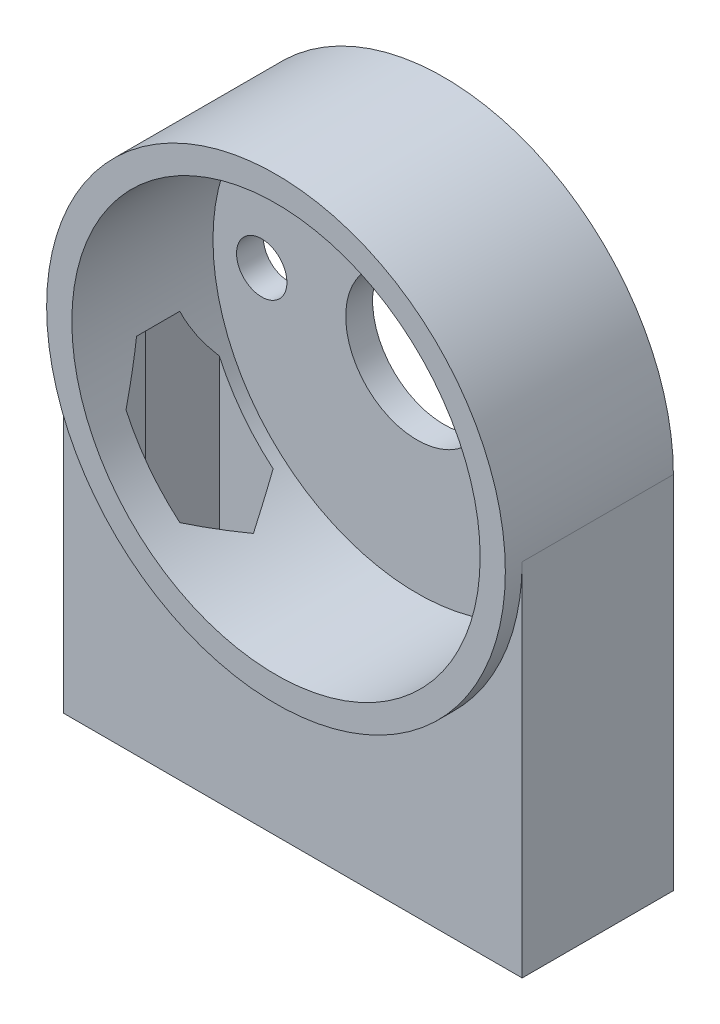
ISO-10303-21;
HEADER;
FILE_DESCRIPTION(('STEP AP214'),'2;1');
FILE_NAME('part.step','',(''),(''),'','','');
FILE_SCHEMA(('AUTOMOTIVE_DESIGN { 1 0 10303 214 1 1 1 1 }'));
ENDSEC;
DATA;
#1=APPLICATION_CONTEXT('core data for automotive mechanical design processes');
#2=APPLICATION_PROTOCOL_DEFINITION('international standard','automotive_design',2000,#1);
#3=PRODUCT_CONTEXT('',#1,'mechanical');
#4=PRODUCT('Part','Part','',(#3));
#5=PRODUCT_RELATED_PRODUCT_CATEGORY('part','',(#4));
#6=PRODUCT_DEFINITION_FORMATION('','',#4);
#7=PRODUCT_DEFINITION_CONTEXT('part definition',#1,'design');
#8=PRODUCT_DEFINITION('design','',#6,#7);
#9=PRODUCT_DEFINITION_SHAPE('','',#8);
#10=(LENGTH_UNIT() NAMED_UNIT(*) SI_UNIT(.MILLI.,.METRE.));
#11=(NAMED_UNIT(*) PLANE_ANGLE_UNIT() SI_UNIT($,.RADIAN.));
#12=(NAMED_UNIT(*) SI_UNIT($,.STERADIAN.) SOLID_ANGLE_UNIT());
#13=UNCERTAINTY_MEASURE_WITH_UNIT(LENGTH_MEASURE(1.E-05),#10,'distance_accuracy_value','');
#14=(GEOMETRIC_REPRESENTATION_CONTEXT(3) GLOBAL_UNCERTAINTY_ASSIGNED_CONTEXT((#13)) GLOBAL_UNIT_ASSIGNED_CONTEXT((#10,
#11,#12)) REPRESENTATION_CONTEXT('',''));
#15=CARTESIAN_POINT('',(0.,0.,0.));
#16=DIRECTION('',(0.,0.,1.));
#17=DIRECTION('',(1.,0.,0.));
#18=AXIS2_PLACEMENT_3D('',#15,#16,#17);
#19=CARTESIAN_POINT('',(0.,21.45,10.));
#20=DIRECTION('',(0.,0.,-1.));
#21=DIRECTION('',(-1.,0.,0.));
#22=AXIS2_PLACEMENT_3D('',#19,#20,#21);
#23=CYLINDRICAL_SURFACE('',#22,12.15);
#24=CARTESIAN_POINT('',(0.,21.45,7.88370336914568));
#25=DIRECTION('',(0.,0.,1.));
#26=DIRECTION('',(1.,0.,0.));
#27=AXIS2_PLACEMENT_3D('',#24,#25,#26);
#28=CIRCLE('',#27,12.15);
#29=CARTESIAN_POINT('',(-11.0421469970312,16.3811254014407,7.88370336913857));
#30=VERTEX_POINT('',#29);
#31=CARTESIAN_POINT('',(-7.83785300296813,12.1661128667197,7.88370336908883));
#32=VERTEX_POINT('',#31);
#33=EDGE_CURVE('E11',#30,#32,#28,.T.);
#34=ORIENTED_EDGE('',*,*,#33,.F.);
#35=CARTESIAN_POINT('',(0.,21.45,27.0092629926444));
#36=DIRECTION('',(-0.866025403784438,0.,0.5));
#37=DIRECTION('',(-0.5,0.,-0.866025403784439));
#38=AXIS2_PLACEMENT_3D('',#35,#36,#37);
#39=ELLIPSE('',#38,24.3,12.15);
#40=CARTESIAN_POINT('',(-11.9004201606517,19.,6.39713064296643));
#41=VERTEX_POINT('',#40);
#42=EDGE_CURVE('E389',#41,#30,#39,.T.);
#43=ORIENTED_EDGE('',*,*,#42,.F.);
#44=DIRECTION('',(0.,0.,-1.));
#45=VECTOR('',#44,1.);
#46=CARTESIAN_POINT('',(-11.9004201606498,19.,10.));
#47=LINE('',#46,#45);
#48=CARTESIAN_POINT('',(-11.9004201606109,19.,3.82027609521174));
#49=VERTEX_POINT('',#48);
#50=EDGE_CURVE('E165',#41,#49,#47,.T.);
#51=ORIENTED_EDGE('',*,*,#50,.T.);
#52=CARTESIAN_POINT('',(0.,21.45,-16.7918562543059));
#53=DIRECTION('',(-0.866025403784438,0.,-0.5));
#54=DIRECTION('',(0.5,0.,-0.866025403784439));
#55=AXIS2_PLACEMENT_3D('',#52,#53,#54);
#56=ELLIPSE('',#55,24.3,12.15);
#57=CARTESIAN_POINT('',(-11.0421469968855,16.3811254012839,2.33370336911776));
#58=VERTEX_POINT('',#57);
#59=EDGE_CURVE('E186',#58,#49,#56,.T.);
#60=ORIENTED_EDGE('',*,*,#59,.F.);
#61=CARTESIAN_POINT('',(0.,21.45,2.33370336911776));
#62=DIRECTION('',(0.,0.,-1.));
#63=DIRECTION('',(-1.,0.,0.));
#64=AXIS2_PLACEMENT_3D('',#61,#62,#63);
#65=CIRCLE('',#64,12.15);
#66=CARTESIAN_POINT('',(-7.83785300302142,12.1661128667444,2.33370336911776));
#67=VERTEX_POINT('',#66);
#68=EDGE_CURVE('E394',#67,#58,#65,.T.);
#69=ORIENTED_EDGE('',*,*,#68,.F.);
#70=CARTESIAN_POINT('',(0.,21.45,15.9092629926098));
#71=DIRECTION('',(0.866025403784438,0.,-0.5));
#72=DIRECTION('',(-0.5,0.,-0.866025403784439));
#73=AXIS2_PLACEMENT_3D('',#70,#71,#72);
#74=ELLIPSE('',#73,24.3,12.15);
#75=CARTESIAN_POINT('',(-6.23570600595258,11.0222259994474,5.1087033691033));
#76=VERTEX_POINT('',#75);
#77=EDGE_CURVE('E397',#76,#67,#74,.T.);
#78=ORIENTED_EDGE('',*,*,#77,.F.);
#79=CARTESIAN_POINT('',(0.,21.45,-5.69185625436376));
#80=DIRECTION('',(0.866025403784439,0.,0.5));
#81=DIRECTION('',(0.5,0.,-0.866025403784439));
#82=AXIS2_PLACEMENT_3D('',#79,#80,#81);
#83=ELLIPSE('',#82,24.3,12.15);
#84=EDGE_CURVE('E47',#32,#76,#83,.T.);
#85=ORIENTED_EDGE('',*,*,#84,.F.);
#86=EDGE_LOOP('',(#34,#43,#51,#60,#69,#78,#85));
#87=FACE_BOUND('',#86,.T.);
#88=CARTESIAN_POINT('',(0.,21.45,2.33370336911776));
#89=DIRECTION('',(0.,0.,-1.));
#90=DIRECTION('',(-1.,0.,0.));
#91=AXIS2_PLACEMENT_3D('',#88,#89,#90);
#92=CIRCLE('',#91,12.15);
#93=CARTESIAN_POINT('',(11.0421469969886,16.3811254013444,2.33370336911776));
#94=VERTEX_POINT('',#93);
#95=CARTESIAN_POINT('',(7.83785300302497,12.1661128666968,2.33370336911776));
#96=VERTEX_POINT('',#95);
#97=EDGE_CURVE('E384',#94,#96,#92,.T.);
#98=ORIENTED_EDGE('',*,*,#97,.F.);
#99=CARTESIAN_POINT('',(0.,21.45,-16.7918562543059));
#100=DIRECTION('',(0.866025403784438,0.,-0.5));
#101=DIRECTION('',(-0.5,0.,-0.866025403784438));
#102=AXIS2_PLACEMENT_3D('',#99,#100,#101);
#103=ELLIPSE('',#102,24.3,12.15);
#104=CARTESIAN_POINT('',(11.9004201606482,19.,3.82027609535385));
#105=VERTEX_POINT('',#104);
#106=EDGE_CURVE('E369',#105,#94,#103,.T.);
#107=ORIENTED_EDGE('',*,*,#106,.F.);
#108=DIRECTION('',(0.,0.,-1.));
#109=VECTOR('',#108,1.);
#110=CARTESIAN_POINT('',(11.9004201606498,19.,10.));
#111=LINE('',#110,#109);
#112=CARTESIAN_POINT('',(11.9004201606535,19.,6.39713064293801));
#113=VERTEX_POINT('',#112);
#114=EDGE_CURVE('E359',#105,#113,#111,.F.);
#115=ORIENTED_EDGE('',*,*,#114,.T.);
#116=CARTESIAN_POINT('',(0.,21.45,27.0092629925875));
#117=DIRECTION('',(0.866025403784439,0.,0.5));
#118=DIRECTION('',(0.5,0.,-0.866025403784439));
#119=AXIS2_PLACEMENT_3D('',#116,#117,#118);
#120=ELLIPSE('',#119,24.3,12.15);
#121=CARTESIAN_POINT('',(11.0421469970277,16.3811254013784,7.88370336914568));
#122=VERTEX_POINT('',#121);
#123=EDGE_CURVE('E372',#122,#113,#120,.T.);
#124=ORIENTED_EDGE('',*,*,#123,.F.);
#125=CARTESIAN_POINT('',(0.,21.45,7.88370336914568));
#126=DIRECTION('',(0.,0.,1.));
#127=DIRECTION('',(1.,0.,0.));
#128=AXIS2_PLACEMENT_3D('',#125,#126,#127);
#129=CIRCLE('',#128,12.15);
#130=CARTESIAN_POINT('',(7.83785300306761,12.1661128667823,7.88370336908173));
#131=VERTEX_POINT('',#130);
#132=EDGE_CURVE('E375',#131,#122,#129,.T.);
#133=ORIENTED_EDGE('',*,*,#132,.F.);
#134=CARTESIAN_POINT('',(0.,21.45,-5.69185625448455));
#135=DIRECTION('',(-0.866025403784439,0.,0.5));
#136=DIRECTION('',(-0.5,0.,-0.866025403784439));
#137=AXIS2_PLACEMENT_3D('',#134,#135,#136);
#138=ELLIPSE('',#137,24.3,12.15);
#139=CARTESIAN_POINT('',(6.23570600606627,11.022225999456,5.10870336898961));
#140=VERTEX_POINT('',#139);
#141=EDGE_CURVE('E378',#140,#131,#138,.T.);
#142=ORIENTED_EDGE('',*,*,#141,.F.);
#143=CARTESIAN_POINT('',(0.,21.45,15.9092629924749));
#144=DIRECTION('',(-0.866025403784439,0.,-0.5));
#145=DIRECTION('',(0.5,0.,-0.866025403784439));
#146=AXIS2_PLACEMENT_3D('',#143,#144,#145);
#147=ELLIPSE('',#146,24.3,12.15);
#148=EDGE_CURVE('E381',#96,#140,#147,.T.);
#149=ORIENTED_EDGE('',*,*,#148,.F.);
#150=EDGE_LOOP('',(#98,#107,#115,#124,#133,#142,#149));
#151=FACE_BOUND('',#150,.T.);
#152=CARTESIAN_POINT('',(0.,21.45,1.6));
#153=DIRECTION('',(0.,0.,1.));
#154=DIRECTION('',(1.,0.,0.));
#155=AXIS2_PLACEMENT_3D('',#152,#153,#154);
#156=CIRCLE('',#155,12.15);
#157=CARTESIAN_POINT('',(12.15,21.45,1.6));
#158=VERTEX_POINT('',#157);
#159=EDGE_CURVE('E353',#158,#158,#156,.T.);
#160=ORIENTED_EDGE('',*,*,#159,.F.);
#161=EDGE_LOOP('',(#160));
#162=FACE_BOUND('',#161,.T.);
#163=CARTESIAN_POINT('',(0.,21.45,10.));
#164=DIRECTION('',(0.,0.,1.));
#165=DIRECTION('',(1.,0.,0.));
#166=AXIS2_PLACEMENT_3D('',#163,#164,#165);
#167=CIRCLE('',#166,12.15);
#168=CARTESIAN_POINT('',(12.15,21.45,10.));
#169=VERTEX_POINT('',#168);
#170=EDGE_CURVE('E345',#169,#169,#167,.T.);
#171=ORIENTED_EDGE('',*,*,#170,.T.);
#172=EDGE_LOOP('',(#171));
#173=FACE_BOUND('',#172,.T.);
#174=ADVANCED_FACE('F39',(#87,#151,#162,#173),#23,.F.);
#175=CARTESIAN_POINT('',(0.,21.45,10.));
#176=DIRECTION('',(0.,0.,-1.));
#177=DIRECTION('',(-1.,0.,0.));
#178=AXIS2_PLACEMENT_3D('',#175,#176,#177);
#179=CYLINDRICAL_SURFACE('',#178,13.65);
#180=CARTESIAN_POINT('',(0.,21.45,10.));
#181=DIRECTION('',(0.,0.,1.));
#182=DIRECTION('',(1.,0.,0.));
#183=AXIS2_PLACEMENT_3D('',#180,#181,#182);
#184=CIRCLE('',#183,13.65);
#185=CARTESIAN_POINT('',(13.65,21.45,10.));
#186=VERTEX_POINT('',#185);
#187=EDGE_CURVE('E349',#186,#186,#184,.T.);
#188=ORIENTED_EDGE('',*,*,#187,.F.);
#189=EDGE_LOOP('',(#188));
#190=FACE_BOUND('',#189,.T.);
#191=DIRECTION('',(0.,0.,-1.));
#192=VECTOR('',#191,1.);
#193=CARTESIAN_POINT('',(-13.65,21.45,9.));
#194=LINE('',#193,#192);
#195=CARTESIAN_POINT('',(-13.65,21.45,9.));
#196=VERTEX_POINT('',#195);
#197=CARTESIAN_POINT('',(-13.65,21.45,0.));
#198=VERTEX_POINT('',#197);
#199=EDGE_CURVE('E316',#196,#198,#194,.T.);
#200=ORIENTED_EDGE('',*,*,#199,.F.);
#201=CARTESIAN_POINT('',(0.,21.45,9.));
#202=DIRECTION('',(0.,0.,-1.));
#203=DIRECTION('',(1.,0.,0.));
#204=AXIS2_PLACEMENT_3D('',#201,#202,#203);
#205=CIRCLE('',#204,13.65);
#206=CARTESIAN_POINT('',(13.65,21.45,9.));
#207=VERTEX_POINT('',#206);
#208=EDGE_CURVE('E281',#207,#196,#205,.T.);
#209=ORIENTED_EDGE('',*,*,#208,.F.);
#210=DIRECTION('',(0.,0.,-1.));
#211=VECTOR('',#210,1.);
#212=CARTESIAN_POINT('',(13.65,21.45,9.));
#213=LINE('',#212,#211);
#214=CARTESIAN_POINT('',(13.65,21.45,0.));
#215=VERTEX_POINT('',#214);
#216=EDGE_CURVE('E296',#207,#215,#213,.T.);
#217=ORIENTED_EDGE('',*,*,#216,.T.);
#218=CARTESIAN_POINT('',(0.,21.45,0.));
#219=DIRECTION('',(0.,0.,1.));
#220=DIRECTION('',(1.,0.,0.));
#221=AXIS2_PLACEMENT_3D('',#218,#219,#220);
#222=CIRCLE('',#221,13.65);
#223=EDGE_CURVE('E334',#215,#198,#222,.T.);
#224=ORIENTED_EDGE('',*,*,#223,.T.);
#225=EDGE_LOOP('',(#200,#209,#217,#224));
#226=FACE_BOUND('',#225,.T.);
#227=ADVANCED_FACE('F438',(#190,#226),#179,.T.);
#228=CARTESIAN_POINT('',(0.,0.,10.));
#229=DIRECTION('',(0.,0.,1.));
#230=DIRECTION('',(1.,0.,0.));
#231=AXIS2_PLACEMENT_3D('',#228,#229,#230);
#232=PLANE('',#231);
#233=ORIENTED_EDGE('',*,*,#170,.F.);
#234=EDGE_LOOP('',(#233));
#235=FACE_BOUND('',#234,.T.);
#236=ORIENTED_EDGE('',*,*,#187,.T.);
#237=EDGE_LOOP('',(#236));
#238=FACE_BOUND('',#237,.T.);
#239=ADVANCED_FACE('F442',(#235,#238),#232,.T.);
#240=CARTESIAN_POINT('',(0.,0.,0.));
#241=DIRECTION('',(0.,0.,1.));
#242=DIRECTION('',(1.,0.,0.));
#243=AXIS2_PLACEMENT_3D('',#240,#241,#242);
#244=PLANE('',#243);
#245=ORIENTED_EDGE('',*,*,#223,.F.);
#246=DIRECTION('',(0.,1.,0.));
#247=VECTOR('',#246,1.);
#248=CARTESIAN_POINT('',(13.65,0.,0.));
#249=LINE('',#248,#247);
#250=CARTESIAN_POINT('',(13.65,0.,0.));
#251=VERTEX_POINT('',#250);
#252=EDGE_CURVE('E286',#251,#215,#249,.T.);
#253=ORIENTED_EDGE('',*,*,#252,.F.);
#254=DIRECTION('',(1.,0.,0.));
#255=VECTOR('',#254,1.);
#256=CARTESIAN_POINT('',(-13.65,0.,0.));
#257=LINE('',#256,#255);
#258=CARTESIAN_POINT('',(-13.65,0.,0.));
#259=VERTEX_POINT('',#258);
#260=EDGE_CURVE('E299',#259,#251,#257,.T.);
#261=ORIENTED_EDGE('',*,*,#260,.F.);
#262=DIRECTION('',(0.,-1.,0.));
#263=VECTOR('',#262,1.);
#264=CARTESIAN_POINT('',(-13.65,21.45,0.));
#265=LINE('',#264,#263);
#266=EDGE_CURVE('E275',#198,#259,#265,.T.);
#267=ORIENTED_EDGE('',*,*,#266,.F.);
#268=EDGE_LOOP('',(#245,#253,#261,#267));
#269=FACE_BOUND('',#268,.T.);
#270=CARTESIAN_POINT('',(-9.25,21.45,0.));
#271=DIRECTION('',(0.,0.,1.));
#272=DIRECTION('',(1.,0.,0.));
#273=AXIS2_PLACEMENT_3D('',#270,#271,#272);
#274=CIRCLE('',#273,1.5);
#275=CARTESIAN_POINT('',(-7.75,21.45,0.));
#276=VERTEX_POINT('',#275);
#277=EDGE_CURVE('E320',#276,#276,#274,.T.);
#278=ORIENTED_EDGE('',*,*,#277,.T.);
#279=EDGE_LOOP('',(#278));
#280=FACE_BOUND('',#279,.T.);
#281=CARTESIAN_POINT('',(9.25,21.45,0.));
#282=DIRECTION('',(0.,0.,1.));
#283=DIRECTION('',(1.,0.,0.));
#284=AXIS2_PLACEMENT_3D('',#281,#282,#283);
#285=CIRCLE('',#284,1.5);
#286=CARTESIAN_POINT('',(10.75,21.45,0.));
#287=VERTEX_POINT('',#286);
#288=EDGE_CURVE('E338',#287,#287,#285,.T.);
#289=ORIENTED_EDGE('',*,*,#288,.T.);
#290=EDGE_LOOP('',(#289));
#291=FACE_BOUND('',#290,.T.);
#292=CARTESIAN_POINT('',(0.,21.45,0.));
#293=DIRECTION('',(0.,0.,1.));
#294=DIRECTION('',(1.,0.,0.));
#295=AXIS2_PLACEMENT_3D('',#292,#293,#294);
#296=CIRCLE('',#295,4.25);
#297=CARTESIAN_POINT('',(4.25,21.45,0.));
#298=VERTEX_POINT('',#297);
#299=EDGE_CURVE('E326',#298,#298,#296,.T.);
#300=ORIENTED_EDGE('',*,*,#299,.T.);
#301=EDGE_LOOP('',(#300));
#302=FACE_BOUND('',#301,.T.);
#303=ADVANCED_FACE('F447',(#269,#280,#291,#302),#244,.F.);
#304=CARTESIAN_POINT('',(0.,21.45,1.6));
#305=DIRECTION('',(0.,0.,-1.));
#306=DIRECTION('',(-1.,0.,0.));
#307=AXIS2_PLACEMENT_3D('',#304,#305,#306);
#308=CYLINDRICAL_SURFACE('',#307,4.25);
#309=CARTESIAN_POINT('',(0.,21.45,1.6));
#310=DIRECTION('',(0.,0.,1.));
#311=DIRECTION('',(1.,0.,0.));
#312=AXIS2_PLACEMENT_3D('',#309,#310,#311);
#313=CIRCLE('',#312,4.25);
#314=CARTESIAN_POINT('',(4.25,21.45,1.6));
#315=VERTEX_POINT('',#314);
#316=EDGE_CURVE('E330',#315,#315,#313,.T.);
#317=ORIENTED_EDGE('',*,*,#316,.T.);
#318=EDGE_LOOP('',(#317));
#319=FACE_BOUND('',#318,.T.);
#320=ORIENTED_EDGE('',*,*,#299,.F.);
#321=EDGE_LOOP('',(#320));
#322=FACE_BOUND('',#321,.T.);
#323=ADVANCED_FACE('F454',(#319,#322),#308,.F.);
#324=CARTESIAN_POINT('',(9.25,21.45,1.6));
#325=DIRECTION('',(0.,0.,-1.));
#326=DIRECTION('',(-1.,0.,0.));
#327=AXIS2_PLACEMENT_3D('',#324,#325,#326);
#328=CYLINDRICAL_SURFACE('',#327,1.5);
#329=CARTESIAN_POINT('',(9.25,21.45,1.6));
#330=DIRECTION('',(0.,0.,1.));
#331=DIRECTION('',(1.,0.,0.));
#332=AXIS2_PLACEMENT_3D('',#329,#330,#331);
#333=CIRCLE('',#332,1.5);
#334=CARTESIAN_POINT('',(10.75,21.45,1.6));
#335=VERTEX_POINT('',#334);
#336=EDGE_CURVE('E325',#335,#335,#333,.T.);
#337=ORIENTED_EDGE('',*,*,#336,.T.);
#338=EDGE_LOOP('',(#337));
#339=FACE_BOUND('',#338,.T.);
#340=ORIENTED_EDGE('',*,*,#288,.F.);
#341=EDGE_LOOP('',(#340));
#342=FACE_BOUND('',#341,.T.);
#343=ADVANCED_FACE('F461',(#339,#342),#328,.F.);
#344=CARTESIAN_POINT('',(-9.25,21.45,1.6));
#345=DIRECTION('',(0.,0.,-1.));
#346=DIRECTION('',(-1.,0.,0.));
#347=AXIS2_PLACEMENT_3D('',#344,#345,#346);
#348=CYLINDRICAL_SURFACE('',#347,1.5);
#349=CARTESIAN_POINT('',(-9.25,21.45,1.6));
#350=DIRECTION('',(0.,0.,1.));
#351=DIRECTION('',(1.,0.,0.));
#352=AXIS2_PLACEMENT_3D('',#349,#350,#351);
#353=CIRCLE('',#352,1.5);
#354=CARTESIAN_POINT('',(-7.75,21.45,1.6));
#355=VERTEX_POINT('',#354);
#356=EDGE_CURVE('E321',#355,#355,#353,.T.);
#357=ORIENTED_EDGE('',*,*,#356,.T.);
#358=EDGE_LOOP('',(#357));
#359=FACE_BOUND('',#358,.T.);
#360=ORIENTED_EDGE('',*,*,#277,.F.);
#361=EDGE_LOOP('',(#360));
#362=FACE_BOUND('',#361,.T.);
#363=ADVANCED_FACE('F457',(#359,#362),#348,.F.);
#364=CARTESIAN_POINT('',(0.,0.,1.6));
#365=DIRECTION('',(0.,0.,1.));
#366=DIRECTION('',(1.,0.,0.));
#367=AXIS2_PLACEMENT_3D('',#364,#365,#366);
#368=PLANE('',#367);
#369=ORIENTED_EDGE('',*,*,#356,.F.);
#370=EDGE_LOOP('',(#369));
#371=FACE_BOUND('',#370,.T.);
#372=ORIENTED_EDGE('',*,*,#336,.F.);
#373=EDGE_LOOP('',(#372));
#374=FACE_BOUND('',#373,.T.);
#375=ORIENTED_EDGE('',*,*,#316,.F.);
#376=EDGE_LOOP('',(#375));
#377=FACE_BOUND('',#376,.T.);
#378=ORIENTED_EDGE('',*,*,#159,.T.);
#379=EDGE_LOOP('',(#378));
#380=FACE_BOUND('',#379,.T.);
#381=ADVANCED_FACE('F460',(#371,#374,#377,#380),#368,.T.);
#382=CARTESIAN_POINT('',(-13.65,21.45,9.));
#383=DIRECTION('',(1.,0.,0.));
#384=DIRECTION('',(0.,0.,-1.));
#385=AXIS2_PLACEMENT_3D('',#382,#383,#384);
#386=PLANE('',#385);
#387=ORIENTED_EDGE('',*,*,#266,.T.);
#388=DIRECTION('',(0.,0.,-1.));
#389=VECTOR('',#388,1.);
#390=CARTESIAN_POINT('',(-13.65,0.,9.));
#391=LINE('',#390,#389);
#392=CARTESIAN_POINT('',(-13.65,0.,9.));
#393=VERTEX_POINT('',#392);
#394=EDGE_CURVE('E312',#393,#259,#391,.T.);
#395=ORIENTED_EDGE('',*,*,#394,.F.);
#396=DIRECTION('',(0.,-1.,0.));
#397=VECTOR('',#396,1.);
#398=CARTESIAN_POINT('',(-13.65,21.45,9.));
#399=LINE('',#398,#397);
#400=EDGE_CURVE('E285',#196,#393,#399,.T.);
#401=ORIENTED_EDGE('',*,*,#400,.F.);
#402=ORIENTED_EDGE('',*,*,#199,.T.);
#403=EDGE_LOOP('',(#387,#395,#401,#402));
#404=FACE_BOUND('',#403,.T.);
#405=ADVANCED_FACE('F471',(#404),#386,.F.);
#406=CARTESIAN_POINT('',(-13.65,0.,9.));
#407=DIRECTION('',(0.,1.,0.));
#408=DIRECTION('',(0.,0.,1.));
#409=AXIS2_PLACEMENT_3D('',#406,#407,#408);
#410=PLANE('',#409);
#411=CARTESIAN_POINT('',(-9.44,0.,5.10870336913172));
#412=DIRECTION('',(0.,1.,0.));
#413=DIRECTION('',(0.,0.,1.));
#414=AXIS2_PLACEMENT_3D('',#411,#412,#413);
#415=CIRCLE('',#414,1.6);
#416=CARTESIAN_POINT('',(-9.44,0.,6.70870336913172));
#417=VERTEX_POINT('',#416);
#418=EDGE_CURVE('E271',#417,#417,#415,.T.);
#419=ORIENTED_EDGE('',*,*,#418,.T.);
#420=EDGE_LOOP('',(#419));
#421=FACE_BOUND('',#420,.T.);
#422=CARTESIAN_POINT('',(9.44,0.,5.10870336913172));
#423=DIRECTION('',(0.,1.,0.));
#424=DIRECTION('',(0.,0.,1.));
#425=AXIS2_PLACEMENT_3D('',#422,#423,#424);
#426=CIRCLE('',#425,1.6);
#427=CARTESIAN_POINT('',(9.44,0.,6.70870336913172));
#428=VERTEX_POINT('',#427);
#429=EDGE_CURVE('E276',#428,#428,#426,.T.);
#430=ORIENTED_EDGE('',*,*,#429,.T.);
#431=EDGE_LOOP('',(#430));
#432=FACE_BOUND('',#431,.T.);
#433=ORIENTED_EDGE('',*,*,#260,.T.);
#434=DIRECTION('',(0.,0.,-1.));
#435=VECTOR('',#434,1.);
#436=CARTESIAN_POINT('',(13.65,0.,9.));
#437=LINE('',#436,#435);
#438=CARTESIAN_POINT('',(13.65,0.,9.));
#439=VERTEX_POINT('',#438);
#440=EDGE_CURVE('E308',#439,#251,#437,.T.);
#441=ORIENTED_EDGE('',*,*,#440,.F.);
#442=DIRECTION('',(1.,0.,0.));
#443=VECTOR('',#442,1.);
#444=CARTESIAN_POINT('',(-13.65,0.,9.));
#445=LINE('',#444,#443);
#446=EDGE_CURVE('E289',#393,#439,#445,.T.);
#447=ORIENTED_EDGE('',*,*,#446,.F.);
#448=ORIENTED_EDGE('',*,*,#394,.T.);
#449=EDGE_LOOP('',(#433,#441,#447,#448));
#450=FACE_BOUND('',#449,.T.);
#451=ADVANCED_FACE('F475',(#421,#432,#450),#410,.F.);
#452=CARTESIAN_POINT('',(13.65,0.,9.));
#453=DIRECTION('',(-1.,0.,0.));
#454=DIRECTION('',(0.,0.,1.));
#455=AXIS2_PLACEMENT_3D('',#452,#453,#454);
#456=PLANE('',#455);
#457=ORIENTED_EDGE('',*,*,#252,.T.);
#458=ORIENTED_EDGE('',*,*,#216,.F.);
#459=DIRECTION('',(0.,1.,0.));
#460=VECTOR('',#459,1.);
#461=CARTESIAN_POINT('',(13.65,0.,9.));
#462=LINE('',#461,#460);
#463=EDGE_CURVE('E292',#439,#207,#462,.T.);
#464=ORIENTED_EDGE('',*,*,#463,.F.);
#465=ORIENTED_EDGE('',*,*,#440,.T.);
#466=EDGE_LOOP('',(#457,#458,#464,#465));
#467=FACE_BOUND('',#466,.T.);
#468=ADVANCED_FACE('F479',(#467),#456,.F.);
#469=CARTESIAN_POINT('',(0.,21.45,9.));
#470=DIRECTION('',(0.,0.,1.));
#471=DIRECTION('',(1.,0.,0.));
#472=AXIS2_PLACEMENT_3D('',#469,#470,#471);
#473=PLANE('',#472);
#474=ORIENTED_EDGE('',*,*,#208,.T.);
#475=ORIENTED_EDGE('',*,*,#400,.T.);
#476=ORIENTED_EDGE('',*,*,#446,.T.);
#477=ORIENTED_EDGE('',*,*,#463,.T.);
#478=EDGE_LOOP('',(#474,#475,#476,#477));
#479=FACE_BOUND('',#478,.T.);
#480=ADVANCED_FACE('F483',(#479),#473,.T.);
#481=CARTESIAN_POINT('',(9.44,18.,5.10870336913172));
#482=DIRECTION('',(0.,-1.,0.));
#483=DIRECTION('',(0.,0.,-1.));
#484=AXIS2_PLACEMENT_3D('',#481,#482,#483);
#485=CYLINDRICAL_SURFACE('',#484,1.6);
#486=CARTESIAN_POINT('',(9.44,3.,5.10870336913172));
#487=DIRECTION('',(0.,-1.,0.));
#488=DIRECTION('',(0.,0.,-1.));
#489=AXIS2_PLACEMENT_3D('',#486,#487,#488);
#490=CIRCLE('',#489,1.6);
#491=CARTESIAN_POINT('',(9.44,3.,3.50870336913172));
#492=VERTEX_POINT('',#491);
#493=EDGE_CURVE('E280',#492,#492,#490,.T.);
#494=ORIENTED_EDGE('',*,*,#493,.F.);
#495=EDGE_LOOP('',(#494));
#496=FACE_BOUND('',#495,.T.);
#497=ORIENTED_EDGE('',*,*,#429,.F.);
#498=EDGE_LOOP('',(#497));
#499=FACE_BOUND('',#498,.T.);
#500=ADVANCED_FACE('F432',(#496,#499),#485,.F.);
#501=CARTESIAN_POINT('',(-9.44,18.,5.10870336913172));
#502=DIRECTION('',(0.,-1.,0.));
#503=DIRECTION('',(0.,0.,-1.));
#504=AXIS2_PLACEMENT_3D('',#501,#502,#503);
#505=CYLINDRICAL_SURFACE('',#504,1.6);
#506=CARTESIAN_POINT('',(-9.44,3.,5.10870336913172));
#507=DIRECTION('',(0.,-1.,0.));
#508=DIRECTION('',(0.,0.,-1.));
#509=AXIS2_PLACEMENT_3D('',#506,#507,#508);
#510=CIRCLE('',#509,1.6);
#511=CARTESIAN_POINT('',(-9.44,3.,3.50870336913172));
#512=VERTEX_POINT('',#511);
#513=EDGE_CURVE('E216',#512,#512,#510,.T.);
#514=ORIENTED_EDGE('',*,*,#513,.F.);
#515=EDGE_LOOP('',(#514));
#516=FACE_BOUND('',#515,.T.);
#517=ORIENTED_EDGE('',*,*,#418,.F.);
#518=EDGE_LOOP('',(#517));
#519=FACE_BOUND('',#518,.T.);
#520=ADVANCED_FACE('F425',(#516,#519),#505,.F.);
#521=CARTESIAN_POINT('',(-400000.,19.,7.88370336914568));
#522=DIRECTION('',(0.,0.,1.));
#523=DIRECTION('',(1.,0.,0.));
#524=AXIS2_PLACEMENT_3D('',#521,#522,#523);
#525=PLANE('',#524);
#526=ORIENTED_EDGE('',*,*,#33,.T.);
#527=DIRECTION('',(0.,-1.,0.));
#528=VECTOR('',#527,1.);
#529=CARTESIAN_POINT('',(-7.83785300296813,19.,7.88370336908883));
#530=LINE('',#529,#528);
#531=CARTESIAN_POINT('',(-7.83785300296813,3.,7.88370336908883));
#532=VERTEX_POINT('',#531);
#533=EDGE_CURVE('E213',#32,#532,#530,.T.);
#534=ORIENTED_EDGE('',*,*,#533,.T.);
#535=DIRECTION('',(-1.,0.,0.));
#536=VECTOR('',#535,1.);
#537=CARTESIAN_POINT('',(-400000.,3.,7.88370336914568));
#538=LINE('',#537,#536);
#539=CARTESIAN_POINT('',(-11.0421469970312,3.,7.88370336913857));
#540=VERTEX_POINT('',#539);
#541=EDGE_CURVE('E192',#532,#540,#538,.T.);
#542=ORIENTED_EDGE('',*,*,#541,.T.);
#543=DIRECTION('',(0.,-1.,0.));
#544=VECTOR('',#543,1.);
#545=CARTESIAN_POINT('',(-11.0421469970312,19.,7.88370336913857));
#546=LINE('',#545,#544);
#547=EDGE_CURVE('E181',#30,#540,#546,.T.);
#548=ORIENTED_EDGE('',*,*,#547,.F.);
#549=EDGE_LOOP('',(#526,#534,#542,#548));
#550=FACE_BOUND('',#549,.T.);
#551=ADVANCED_FACE('F423',(#550),#525,.F.);
#552=CARTESIAN_POINT('',(-226268.752011476,19.,391903.282792824));
#553=DIRECTION('',(0.866025403784439,0.,0.5));
#554=DIRECTION('',(0.5,0.,-0.866025403784439));
#555=AXIS2_PLACEMENT_3D('',#552,#553,#554);
#556=PLANE('',#555);
#557=ORIENTED_EDGE('',*,*,#84,.T.);
#558=DIRECTION('',(0.,-1.,0.));
#559=VECTOR('',#558,1.);
#560=CARTESIAN_POINT('',(-6.23570600595258,19.,5.1087033691033));
#561=LINE('',#560,#559);
#562=CARTESIAN_POINT('',(-6.23570600595258,3.,5.1087033691033));
#563=VERTEX_POINT('',#562);
#564=EDGE_CURVE('E217',#76,#563,#561,.T.);
#565=ORIENTED_EDGE('',*,*,#564,.T.);
#566=DIRECTION('',(-0.5,0.,0.866025403784439));
#567=VECTOR('',#566,1.);
#568=CARTESIAN_POINT('',(-226268.752011476,3.,391903.282792824));
#569=LINE('',#568,#567);
#570=EDGE_CURVE('E169',#563,#532,#569,.T.);
#571=ORIENTED_EDGE('',*,*,#570,.T.);
#572=ORIENTED_EDGE('',*,*,#533,.F.);
#573=EDGE_LOOP('',(#557,#565,#571,#572));
#574=FACE_BOUND('',#573,.T.);
#575=ADVANCED_FACE('F404',(#574),#556,.F.);
#576=CARTESIAN_POINT('',(26259.3984524666,19.,45498.5215588603));
#577=DIRECTION('',(0.866025403784438,0.,-0.5));
#578=DIRECTION('',(-0.5,0.,-0.866025403784439));
#579=AXIS2_PLACEMENT_3D('',#576,#577,#578);
#580=PLANE('',#579);
#581=ORIENTED_EDGE('',*,*,#77,.T.);
#582=DIRECTION('',(0.,-1.,0.));
#583=VECTOR('',#582,1.);
#584=CARTESIAN_POINT('',(-7.83785300302142,19.,2.33370336911776));
#585=LINE('',#584,#583);
#586=CARTESIAN_POINT('',(-7.83785300302142,3.,2.33370336911776));
#587=VERTEX_POINT('',#586);
#588=EDGE_CURVE('E220',#67,#587,#585,.T.);
#589=ORIENTED_EDGE('',*,*,#588,.T.);
#590=DIRECTION('',(0.5,0.,0.866025403784439));
#591=VECTOR('',#590,1.);
#592=CARTESIAN_POINT('',(26259.3984524666,3.,45498.5215588603));
#593=LINE('',#592,#591);
#594=EDGE_CURVE('E206',#587,#563,#593,.T.);
#595=ORIENTED_EDGE('',*,*,#594,.T.);
#596=ORIENTED_EDGE('',*,*,#564,.F.);
#597=EDGE_LOOP('',(#581,#589,#595,#596));
#598=FACE_BOUND('',#597,.T.);
#599=ADVANCED_FACE('F409',(#598),#580,.F.);
#600=CARTESIAN_POINT('',(-400000.,19.,2.33370336911776));
#601=DIRECTION('',(0.,0.,-1.));
#602=DIRECTION('',(-1.,0.,0.));
#603=AXIS2_PLACEMENT_3D('',#600,#601,#602);
#604=PLANE('',#603);
#605=ORIENTED_EDGE('',*,*,#68,.T.);
#606=DIRECTION('',(0.,-1.,0.));
#607=VECTOR('',#606,1.);
#608=CARTESIAN_POINT('',(-11.0421469968855,19.,2.33370336911776));
#609=LINE('',#608,#607);
#610=CARTESIAN_POINT('',(-11.0421469968855,3.,2.33370336911776));
#611=VERTEX_POINT('',#610);
#612=EDGE_CURVE('E180',#58,#611,#609,.T.);
#613=ORIENTED_EDGE('',*,*,#612,.T.);
#614=DIRECTION('',(1.,0.,0.));
#615=VECTOR('',#614,1.);
#616=CARTESIAN_POINT('',(-400000.,3.,2.33370336911776));
#617=LINE('',#616,#615);
#618=EDGE_CURVE('E202',#611,#587,#617,.T.);
#619=ORIENTED_EDGE('',*,*,#618,.T.);
#620=ORIENTED_EDGE('',*,*,#588,.F.);
#621=EDGE_LOOP('',(#605,#613,#619,#620));
#622=FACE_BOUND('',#621,.T.);
#623=ADVANCED_FACE('F416',(#622),#604,.F.);
#624=CARTESIAN_POINT('',(-226273.558452467,19.,391900.507792824));
#625=DIRECTION('',(-0.866025403784438,0.,-0.5));
#626=DIRECTION('',(-0.5,0.,0.866025403784439));
#627=AXIS2_PLACEMENT_3D('',#624,#625,#626);
#628=PLANE('',#627);
#629=ORIENTED_EDGE('',*,*,#59,.T.);
#630=DIRECTION('',(0.5,0.,-0.866025403784439));
#631=VECTOR('',#630,1.);
#632=CARTESIAN_POINT('',(-226273.558452467,19.,391900.507792824));
#633=LINE('',#632,#631);
#634=CARTESIAN_POINT('',(-12.6442939939295,19.,5.10870336898961));
#635=VERTEX_POINT('',#634);
#636=EDGE_CURVE('E54',#635,#49,#633,.T.);
#637=ORIENTED_EDGE('',*,*,#636,.F.);
#638=DIRECTION('',(0.,-1.,0.));
#639=VECTOR('',#638,1.);
#640=CARTESIAN_POINT('',(-12.6442939939295,19.,5.10870336898961));
#641=LINE('',#640,#639);
#642=CARTESIAN_POINT('',(-12.6442939939295,3.,5.10870336898961));
#643=VERTEX_POINT('',#642);
#644=EDGE_CURVE('E172',#635,#643,#641,.T.);
#645=ORIENTED_EDGE('',*,*,#644,.T.);
#646=DIRECTION('',(0.5,0.,-0.866025403784439));
#647=VECTOR('',#646,1.);
#648=CARTESIAN_POINT('',(-226273.558452467,3.,391900.507792824));
#649=LINE('',#648,#647);
#650=EDGE_CURVE('E199',#643,#611,#649,.T.);
#651=ORIENTED_EDGE('',*,*,#650,.T.);
#652=ORIENTED_EDGE('',*,*,#612,.F.);
#653=EDGE_LOOP('',(#629,#637,#645,#651,#652));
#654=FACE_BOUND('',#653,.T.);
#655=ADVANCED_FACE('F183',(#654),#628,.F.);
#656=CARTESIAN_POINT('',(26254.5920114756,19.,45501.2965588603));
#657=DIRECTION('',(-0.866025403784438,0.,0.5));
#658=DIRECTION('',(0.5,0.,0.866025403784439));
#659=AXIS2_PLACEMENT_3D('',#656,#657,#658);
#660=PLANE('',#659);
#661=ORIENTED_EDGE('',*,*,#42,.T.);
#662=ORIENTED_EDGE('',*,*,#547,.T.);
#663=DIRECTION('',(-0.5,0.,-0.866025403784439));
#664=VECTOR('',#663,1.);
#665=CARTESIAN_POINT('',(26254.5920114756,3.,45501.2965588603));
#666=LINE('',#665,#664);
#667=EDGE_CURVE('E175',#540,#643,#666,.T.);
#668=ORIENTED_EDGE('',*,*,#667,.T.);
#669=ORIENTED_EDGE('',*,*,#644,.F.);
#670=DIRECTION('',(-0.5,0.,-0.866025403784439));
#671=VECTOR('',#670,1.);
#672=CARTESIAN_POINT('',(26254.5920114756,19.,45501.2965588603));
#673=LINE('',#672,#671);
#674=EDGE_CURVE('E161',#41,#635,#673,.T.);
#675=ORIENTED_EDGE('',*,*,#674,.F.);
#676=EDGE_LOOP('',(#661,#662,#668,#669,#675));
#677=FACE_BOUND('',#676,.T.);
#678=ADVANCED_FACE('F173',(#677),#660,.F.);
#679=CARTESIAN_POINT('',(0.,19.,0.));
#680=DIRECTION('',(0.,-1.,0.));
#681=DIRECTION('',(0.,0.,-1.));
#682=AXIS2_PLACEMENT_3D('',#679,#680,#681);
#683=PLANE('',#682);
#684=ORIENTED_EDGE('',*,*,#674,.T.);
#685=ORIENTED_EDGE('',*,*,#636,.T.);
#686=ORIENTED_EDGE('',*,*,#50,.F.);
#687=EDGE_LOOP('',(#684,#685,#686));
#688=FACE_BOUND('',#687,.T.);
#689=ADVANCED_FACE('F163',(#688),#683,.T.);
#690=CARTESIAN_POINT('',(0.,3.,0.));
#691=DIRECTION('',(0.,-1.,0.));
#692=DIRECTION('',(0.,0.,-1.));
#693=AXIS2_PLACEMENT_3D('',#690,#691,#692);
#694=PLANE('',#693);
#695=ORIENTED_EDGE('',*,*,#513,.T.);
#696=EDGE_LOOP('',(#695));
#697=FACE_BOUND('',#696,.T.);
#698=ORIENTED_EDGE('',*,*,#541,.F.);
#699=ORIENTED_EDGE('',*,*,#570,.F.);
#700=ORIENTED_EDGE('',*,*,#594,.F.);
#701=ORIENTED_EDGE('',*,*,#618,.F.);
#702=ORIENTED_EDGE('',*,*,#650,.F.);
#703=ORIENTED_EDGE('',*,*,#667,.F.);
#704=EDGE_LOOP('',(#698,#699,#700,#701,#702,#703));
#705=FACE_BOUND('',#704,.T.);
#706=ADVANCED_FACE('F420',(#697,#705),#694,.F.);
#707=CARTESIAN_POINT('',(-400000.,19.,7.88370336914568));
#708=DIRECTION('',(0.,0.,1.));
#709=DIRECTION('',(1.,0.,0.));
#710=AXIS2_PLACEMENT_3D('',#707,#708,#709);
#711=PLANE('',#710);
#712=ORIENTED_EDGE('',*,*,#132,.T.);
#713=DIRECTION('',(0.,-1.,0.));
#714=VECTOR('',#713,1.);
#715=CARTESIAN_POINT('',(11.0421469970277,19.,7.88370336914568));
#716=LINE('',#715,#714);
#717=CARTESIAN_POINT('',(11.0421469970277,3.,7.88370336914568));
#718=VERTEX_POINT('',#717);
#719=EDGE_CURVE('E196',#122,#718,#716,.T.);
#720=ORIENTED_EDGE('',*,*,#719,.T.);
#721=DIRECTION('',(-1.,0.,0.));
#722=VECTOR('',#721,1.);
#723=CARTESIAN_POINT('',(-400000.,3.,7.88370336914568));
#724=LINE('',#723,#722);
#725=CARTESIAN_POINT('',(7.83785300306761,3.,7.88370336908173));
#726=VERTEX_POINT('',#725);
#727=EDGE_CURVE('E232',#718,#726,#724,.T.);
#728=ORIENTED_EDGE('',*,*,#727,.T.);
#729=DIRECTION('',(0.,-1.,0.));
#730=VECTOR('',#729,1.);
#731=CARTESIAN_POINT('',(7.83785300306761,19.,7.88370336908173));
#732=LINE('',#731,#730);
#733=EDGE_CURVE('E231',#131,#726,#732,.T.);
#734=ORIENTED_EDGE('',*,*,#733,.F.);
#735=EDGE_LOOP('',(#712,#720,#728,#734));
#736=FACE_BOUND('',#735,.T.);
#737=ADVANCED_FACE('F491',(#736),#711,.F.);
#738=CARTESIAN_POINT('',(-226254.592011476,19.,391911.458072636));
#739=DIRECTION('',(0.866025403784439,0.,0.5));
#740=DIRECTION('',(0.5,0.,-0.866025403784439));
#741=AXIS2_PLACEMENT_3D('',#738,#739,#740);
#742=PLANE('',#741);
#743=ORIENTED_EDGE('',*,*,#123,.T.);
#744=DIRECTION('',(-0.5,0.,0.866025403784439));
#745=VECTOR('',#744,1.);
#746=CARTESIAN_POINT('',(-226254.592011476,19.,391911.458072636));
#747=LINE('',#746,#745);
#748=CARTESIAN_POINT('',(12.6442939940432,19.,5.1087033691033));
#749=VERTEX_POINT('',#748);
#750=EDGE_CURVE('E62',#749,#113,#747,.T.);
#751=ORIENTED_EDGE('',*,*,#750,.F.);
#752=DIRECTION('',(0.,-1.,0.));
#753=VECTOR('',#752,1.);
#754=CARTESIAN_POINT('',(12.6442939940432,19.,5.1087033691033));
#755=LINE('',#754,#753);
#756=CARTESIAN_POINT('',(12.6442939940432,3.,5.1087033691033));
#757=VERTEX_POINT('',#756);
#758=EDGE_CURVE('E257',#749,#757,#755,.T.);
#759=ORIENTED_EDGE('',*,*,#758,.T.);
#760=DIRECTION('',(-0.5,0.,0.866025403784439));
#761=VECTOR('',#760,1.);
#762=CARTESIAN_POINT('',(-226254.592011476,3.,391911.458072636));
#763=LINE('',#762,#761);
#764=EDGE_CURVE('E228',#757,#718,#763,.T.);
#765=ORIENTED_EDGE('',*,*,#764,.T.);
#766=ORIENTED_EDGE('',*,*,#719,.F.);
#767=EDGE_LOOP('',(#743,#751,#759,#765,#766));
#768=FACE_BOUND('',#767,.T.);
#769=ADVANCED_FACE('F494',(#768),#742,.F.);
#770=CARTESIAN_POINT('',(26273.5584524666,19.,45490.3462790485));
#771=DIRECTION('',(0.866025403784438,0.,-0.5));
#772=DIRECTION('',(-0.5,0.,-0.866025403784438));
#773=AXIS2_PLACEMENT_3D('',#770,#771,#772);
#774=PLANE('',#773);
#775=ORIENTED_EDGE('',*,*,#106,.T.);
#776=DIRECTION('',(0.,-1.,0.));
#777=VECTOR('',#776,1.);
#778=CARTESIAN_POINT('',(11.0421469969886,19.,2.33370336912486));
#779=LINE('',#778,#777);
#780=CARTESIAN_POINT('',(11.0421469969886,3.,2.33370336912486));
#781=VERTEX_POINT('',#780);
#782=EDGE_CURVE('E260',#94,#781,#779,.T.);
#783=ORIENTED_EDGE('',*,*,#782,.T.);
#784=DIRECTION('',(0.5,0.,0.866025403784438));
#785=VECTOR('',#784,1.);
#786=CARTESIAN_POINT('',(26273.5584524666,3.,45490.3462790485));
#787=LINE('',#786,#785);
#788=EDGE_CURVE('E248',#781,#757,#787,.T.);
#789=ORIENTED_EDGE('',*,*,#788,.T.);
#790=ORIENTED_EDGE('',*,*,#758,.F.);
#791=DIRECTION('',(0.5,0.,0.866025403784438));
#792=VECTOR('',#791,1.);
#793=CARTESIAN_POINT('',(26273.5584524666,19.,45490.3462790485));
#794=LINE('',#793,#792);
#795=EDGE_CURVE('E225',#105,#749,#794,.T.);
#796=ORIENTED_EDGE('',*,*,#795,.F.);
#797=EDGE_LOOP('',(#775,#783,#789,#790,#796));
#798=FACE_BOUND('',#797,.T.);
#799=ADVANCED_FACE('F508',(#798),#774,.F.);
#800=CARTESIAN_POINT('',(-400000.,19.,2.33370336911776));
#801=DIRECTION('',(0.,0.,-1.));
#802=DIRECTION('',(-1.,0.,0.));
#803=AXIS2_PLACEMENT_3D('',#800,#801,#802);
#804=PLANE('',#803);
#805=ORIENTED_EDGE('',*,*,#97,.T.);
#806=DIRECTION('',(0.,-1.,0.));
#807=VECTOR('',#806,1.);
#808=CARTESIAN_POINT('',(7.83785300302497,19.,2.33370336911776));
#809=LINE('',#808,#807);
#810=CARTESIAN_POINT('',(7.83785300302497,3.,2.33370336911776));
#811=VERTEX_POINT('',#810);
#812=EDGE_CURVE('E263',#96,#811,#809,.T.);
#813=ORIENTED_EDGE('',*,*,#812,.T.);
#814=DIRECTION('',(1.,0.,0.));
#815=VECTOR('',#814,1.);
#816=CARTESIAN_POINT('',(-400000.,3.,2.33370336911776));
#817=LINE('',#816,#815);
#818=EDGE_CURVE('E244',#811,#781,#817,.T.);
#819=ORIENTED_EDGE('',*,*,#818,.T.);
#820=ORIENTED_EDGE('',*,*,#782,.F.);
#821=EDGE_LOOP('',(#805,#813,#819,#820));
#822=FACE_BOUND('',#821,.T.);
#823=ADVANCED_FACE('F504',(#822),#804,.F.);
#824=CARTESIAN_POINT('',(-226259.398452467,19.,391908.683072636));
#825=DIRECTION('',(-0.866025403784439,0.,-0.5));
#826=DIRECTION('',(-0.5,0.,0.866025403784439));
#827=AXIS2_PLACEMENT_3D('',#824,#825,#826);
#828=PLANE('',#827);
#829=ORIENTED_EDGE('',*,*,#148,.T.);
#830=DIRECTION('',(0.,-1.,0.));
#831=VECTOR('',#830,1.);
#832=CARTESIAN_POINT('',(6.23570600606627,19.,5.10870336898961));
#833=LINE('',#832,#831);
#834=CARTESIAN_POINT('',(6.23570600606627,3.,5.10870336898961));
#835=VERTEX_POINT('',#834);
#836=EDGE_CURVE('E266',#140,#835,#833,.T.);
#837=ORIENTED_EDGE('',*,*,#836,.T.);
#838=DIRECTION('',(0.5,0.,-0.866025403784439));
#839=VECTOR('',#838,1.);
#840=CARTESIAN_POINT('',(-226259.398452467,3.,391908.683072636));
#841=LINE('',#840,#839);
#842=EDGE_CURVE('E240',#835,#811,#841,.T.);
#843=ORIENTED_EDGE('',*,*,#842,.T.);
#844=ORIENTED_EDGE('',*,*,#812,.F.);
#845=EDGE_LOOP('',(#829,#837,#843,#844));
#846=FACE_BOUND('',#845,.T.);
#847=ADVANCED_FACE('F500',(#846),#828,.F.);
#848=CARTESIAN_POINT('',(26268.7520114758,19.,45493.1212790487));
#849=DIRECTION('',(-0.866025403784439,0.,0.5));
#850=DIRECTION('',(0.5,0.,0.866025403784439));
#851=AXIS2_PLACEMENT_3D('',#848,#849,#850);
#852=PLANE('',#851);
#853=ORIENTED_EDGE('',*,*,#141,.T.);
#854=ORIENTED_EDGE('',*,*,#733,.T.);
#855=DIRECTION('',(-0.5,0.,-0.866025403784439));
#856=VECTOR('',#855,1.);
#857=CARTESIAN_POINT('',(26268.7520114758,3.,45493.1212790487));
#858=LINE('',#857,#856);
#859=EDGE_CURVE('E236',#726,#835,#858,.T.);
#860=ORIENTED_EDGE('',*,*,#859,.T.);
#861=ORIENTED_EDGE('',*,*,#836,.F.);
#862=EDGE_LOOP('',(#853,#854,#860,#861));
#863=FACE_BOUND('',#862,.T.);
#864=ADVANCED_FACE('F496',(#863),#852,.F.);
#865=CARTESIAN_POINT('',(0.,19.,0.));
#866=DIRECTION('',(0.,-1.,0.));
#867=DIRECTION('',(0.,0.,-1.));
#868=AXIS2_PLACEMENT_3D('',#865,#866,#867);
#869=PLANE('',#868);
#870=ORIENTED_EDGE('',*,*,#795,.T.);
#871=ORIENTED_EDGE('',*,*,#750,.T.);
#872=ORIENTED_EDGE('',*,*,#114,.F.);
#873=EDGE_LOOP('',(#870,#871,#872));
#874=FACE_BOUND('',#873,.T.);
#875=ADVANCED_FACE('F499',(#874),#869,.T.);
#876=CARTESIAN_POINT('',(0.,3.,0.));
#877=DIRECTION('',(0.,-1.,0.));
#878=DIRECTION('',(0.,0.,-1.));
#879=AXIS2_PLACEMENT_3D('',#876,#877,#878);
#880=PLANE('',#879);
#881=ORIENTED_EDGE('',*,*,#493,.T.);
#882=EDGE_LOOP('',(#881));
#883=FACE_BOUND('',#882,.T.);
#884=ORIENTED_EDGE('',*,*,#727,.F.);
#885=ORIENTED_EDGE('',*,*,#764,.F.);
#886=ORIENTED_EDGE('',*,*,#788,.F.);
#887=ORIENTED_EDGE('',*,*,#818,.F.);
#888=ORIENTED_EDGE('',*,*,#842,.F.);
#889=ORIENTED_EDGE('',*,*,#859,.F.);
#890=EDGE_LOOP('',(#884,#885,#886,#887,#888,#889));
#891=FACE_BOUND('',#890,.T.);
#892=ADVANCED_FACE('F516',(#883,#891),#880,.F.);
#893=CLOSED_SHELL('',(#174,#227,#239,#303,#323,#343,#363,#381,#405,#451,#468,#480,#500,#520,
#551,#575,#599,#623,#655,#678,#689,#706,#737,#769,#799,#823,#847,#864,#875,#892));
#894=MANIFOLD_SOLID_BREP('B2',#893);
#895=ADVANCED_BREP_SHAPE_REPRESENTATION('',(#18,#894),#14);
#896=SHAPE_DEFINITION_REPRESENTATION(#9,#895);
ENDSEC;
END-ISO-10303-21;
